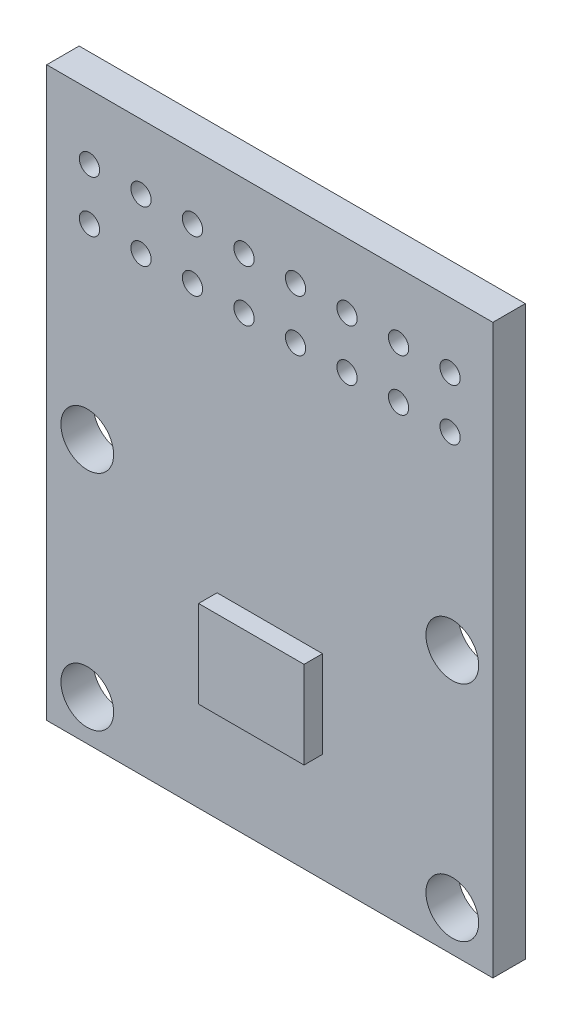
ISO-10303-21;
HEADER;
FILE_DESCRIPTION(('STEP AP214'),'2;1');
FILE_NAME('part.step','',(''),(''),'','','');
FILE_SCHEMA(('AUTOMOTIVE_DESIGN { 1 0 10303 214 1 1 1 1 }'));
ENDSEC;
DATA;
#1=APPLICATION_CONTEXT('core data for automotive mechanical design processes');
#2=APPLICATION_PROTOCOL_DEFINITION('international standard','automotive_design',2000,#1);
#3=PRODUCT_CONTEXT('',#1,'mechanical');
#4=PRODUCT('Part','Part','',(#3));
#5=PRODUCT_RELATED_PRODUCT_CATEGORY('part','',(#4));
#6=PRODUCT_DEFINITION_FORMATION('','',#4);
#7=PRODUCT_DEFINITION_CONTEXT('part definition',#1,'design');
#8=PRODUCT_DEFINITION('design','',#6,#7);
#9=PRODUCT_DEFINITION_SHAPE('','',#8);
#10=(LENGTH_UNIT() NAMED_UNIT(*) SI_UNIT(.MILLI.,.METRE.));
#11=(NAMED_UNIT(*) PLANE_ANGLE_UNIT() SI_UNIT($,.RADIAN.));
#12=(NAMED_UNIT(*) SI_UNIT($,.STERADIAN.) SOLID_ANGLE_UNIT());
#13=UNCERTAINTY_MEASURE_WITH_UNIT(LENGTH_MEASURE(1.E-05),#10,'distance_accuracy_value','');
#14=(GEOMETRIC_REPRESENTATION_CONTEXT(3) GLOBAL_UNCERTAINTY_ASSIGNED_CONTEXT((#13)) GLOBAL_UNIT_ASSIGNED_CONTEXT((#10,
#11,#12)) REPRESENTATION_CONTEXT('',''));
#15=CARTESIAN_POINT('',(0.,0.,0.));
#16=DIRECTION('',(0.,0.,1.));
#17=DIRECTION('',(1.,0.,0.));
#18=AXIS2_PLACEMENT_3D('',#15,#16,#17);
#19=CARTESIAN_POINT('',(0.,0.,1.6));
#20=DIRECTION('',(0.,0.,-1.));
#21=DIRECTION('',(-1.,0.,0.));
#22=AXIS2_PLACEMENT_3D('',#19,#20,#21);
#23=PLANE('',#22);
#24=CARTESIAN_POINT('',(-8.88999999999997,8.26,1.6));
#25=DIRECTION('',(0.,0.,1.));
#26=DIRECTION('',(1.,0.,0.));
#27=AXIS2_PLACEMENT_3D('',#24,#25,#26);
#28=CIRCLE('',#27,0.500000000000001);
#29=CARTESIAN_POINT('',(-8.38999999999997,8.26,1.6));
#30=VERTEX_POINT('',#29);
#31=EDGE_CURVE('E135',#30,#30,#28,.T.);
#32=ORIENTED_EDGE('',*,*,#31,.F.);
#33=EDGE_LOOP('',(#32));
#34=FACE_BOUND('',#33,.T.);
#35=CARTESIAN_POINT('',(8.89000000000003,8.26,1.6));
#36=DIRECTION('',(0.,0.,1.));
#37=DIRECTION('',(1.,0.,0.));
#38=AXIS2_PLACEMENT_3D('',#35,#36,#37);
#39=CIRCLE('',#38,0.500000000000001);
#40=CARTESIAN_POINT('',(9.39000000000003,8.26,1.6));
#41=VERTEX_POINT('',#40);
#42=EDGE_CURVE('E141',#41,#41,#39,.T.);
#43=ORIENTED_EDGE('',*,*,#42,.F.);
#44=EDGE_LOOP('',(#43));
#45=FACE_BOUND('',#44,.T.);
#46=CARTESIAN_POINT('',(6.35000000000003,8.26,1.6));
#47=DIRECTION('',(0.,0.,1.));
#48=DIRECTION('',(1.,0.,0.));
#49=AXIS2_PLACEMENT_3D('',#46,#47,#48);
#50=CIRCLE('',#49,0.500000000000001);
#51=CARTESIAN_POINT('',(6.85000000000003,8.26,1.6));
#52=VERTEX_POINT('',#51);
#53=EDGE_CURVE('E149',#52,#52,#50,.T.);
#54=ORIENTED_EDGE('',*,*,#53,.F.);
#55=EDGE_LOOP('',(#54));
#56=FACE_BOUND('',#55,.T.);
#57=CARTESIAN_POINT('',(3.81000000000003,8.26,1.6));
#58=DIRECTION('',(0.,0.,1.));
#59=DIRECTION('',(1.,0.,0.));
#60=AXIS2_PLACEMENT_3D('',#57,#58,#59);
#61=CIRCLE('',#60,0.500000000000001);
#62=CARTESIAN_POINT('',(4.31000000000003,8.26,1.6));
#63=VERTEX_POINT('',#62);
#64=EDGE_CURVE('E154',#63,#63,#61,.T.);
#65=ORIENTED_EDGE('',*,*,#64,.F.);
#66=EDGE_LOOP('',(#65));
#67=FACE_BOUND('',#66,.T.);
#68=CARTESIAN_POINT('',(1.27000000000003,8.26,1.6));
#69=DIRECTION('',(0.,0.,1.));
#70=DIRECTION('',(1.,0.,0.));
#71=AXIS2_PLACEMENT_3D('',#68,#69,#70);
#72=CIRCLE('',#71,0.500000000000001);
#73=CARTESIAN_POINT('',(1.77000000000003,8.26,1.6));
#74=VERTEX_POINT('',#73);
#75=EDGE_CURVE('E161',#74,#74,#72,.T.);
#76=ORIENTED_EDGE('',*,*,#75,.F.);
#77=EDGE_LOOP('',(#76));
#78=FACE_BOUND('',#77,.T.);
#79=CARTESIAN_POINT('',(-1.26999999999997,8.26,1.6));
#80=DIRECTION('',(0.,0.,1.));
#81=DIRECTION('',(1.,0.,0.));
#82=AXIS2_PLACEMENT_3D('',#79,#80,#81);
#83=CIRCLE('',#82,0.500000000000001);
#84=CARTESIAN_POINT('',(-0.769999999999972,8.26,1.6));
#85=VERTEX_POINT('',#84);
#86=EDGE_CURVE('E170',#85,#85,#83,.T.);
#87=ORIENTED_EDGE('',*,*,#86,.F.);
#88=EDGE_LOOP('',(#87));
#89=FACE_BOUND('',#88,.T.);
#90=CARTESIAN_POINT('',(-3.80999999999997,8.26,1.6));
#91=DIRECTION('',(0.,0.,1.));
#92=DIRECTION('',(1.,0.,0.));
#93=AXIS2_PLACEMENT_3D('',#90,#91,#92);
#94=CIRCLE('',#93,0.500000000000001);
#95=CARTESIAN_POINT('',(-3.30999999999997,8.26,1.6));
#96=VERTEX_POINT('',#95);
#97=EDGE_CURVE('E172',#96,#96,#94,.T.);
#98=ORIENTED_EDGE('',*,*,#97,.F.);
#99=EDGE_LOOP('',(#98));
#100=FACE_BOUND('',#99,.T.);
#101=CARTESIAN_POINT('',(-6.34999999999997,8.26,1.6));
#102=DIRECTION('',(0.,0.,1.));
#103=DIRECTION('',(1.,0.,0.));
#104=AXIS2_PLACEMENT_3D('',#101,#102,#103);
#105=CIRCLE('',#104,0.500000000000001);
#106=CARTESIAN_POINT('',(-5.84999999999997,8.26,1.6));
#107=VERTEX_POINT('',#106);
#108=EDGE_CURVE('E177',#107,#107,#105,.T.);
#109=ORIENTED_EDGE('',*,*,#108,.F.);
#110=EDGE_LOOP('',(#109));
#111=FACE_BOUND('',#110,.T.);
#112=CARTESIAN_POINT('',(8.89,10.8,1.6));
#113=DIRECTION('',(0.,0.,1.));
#114=DIRECTION('',(1.,0.,0.));
#115=AXIS2_PLACEMENT_3D('',#112,#113,#114);
#116=CIRCLE('',#115,0.500000000000001);
#117=CARTESIAN_POINT('',(9.39,10.8,1.6));
#118=VERTEX_POINT('',#117);
#119=EDGE_CURVE('E183',#118,#118,#116,.T.);
#120=ORIENTED_EDGE('',*,*,#119,.F.);
#121=EDGE_LOOP('',(#120));
#122=FACE_BOUND('',#121,.T.);
#123=CARTESIAN_POINT('',(6.35,10.8,1.6));
#124=DIRECTION('',(0.,0.,1.));
#125=DIRECTION('',(1.,0.,0.));
#126=AXIS2_PLACEMENT_3D('',#123,#124,#125);
#127=CIRCLE('',#126,0.500000000000001);
#128=CARTESIAN_POINT('',(6.85,10.8,1.6));
#129=VERTEX_POINT('',#128);
#130=EDGE_CURVE('E191',#129,#129,#127,.T.);
#131=ORIENTED_EDGE('',*,*,#130,.F.);
#132=EDGE_LOOP('',(#131));
#133=FACE_BOUND('',#132,.T.);
#134=CARTESIAN_POINT('',(3.81,10.8,1.6));
#135=DIRECTION('',(0.,0.,1.));
#136=DIRECTION('',(1.,0.,0.));
#137=AXIS2_PLACEMENT_3D('',#134,#135,#136);
#138=CIRCLE('',#137,0.500000000000001);
#139=CARTESIAN_POINT('',(4.31,10.8,1.6));
#140=VERTEX_POINT('',#139);
#141=EDGE_CURVE('E197',#140,#140,#138,.T.);
#142=ORIENTED_EDGE('',*,*,#141,.F.);
#143=EDGE_LOOP('',(#142));
#144=FACE_BOUND('',#143,.T.);
#145=CARTESIAN_POINT('',(1.27,10.8,1.6));
#146=DIRECTION('',(0.,0.,1.));
#147=DIRECTION('',(1.,0.,0.));
#148=AXIS2_PLACEMENT_3D('',#145,#146,#147);
#149=CIRCLE('',#148,0.500000000000001);
#150=CARTESIAN_POINT('',(1.77,10.8,1.6));
#151=VERTEX_POINT('',#150);
#152=EDGE_CURVE('E201',#151,#151,#149,.T.);
#153=ORIENTED_EDGE('',*,*,#152,.F.);
#154=EDGE_LOOP('',(#153));
#155=FACE_BOUND('',#154,.T.);
#156=CARTESIAN_POINT('',(-1.27,10.8,1.6));
#157=DIRECTION('',(0.,0.,1.));
#158=DIRECTION('',(1.,0.,0.));
#159=AXIS2_PLACEMENT_3D('',#156,#157,#158);
#160=CIRCLE('',#159,0.500000000000001);
#161=CARTESIAN_POINT('',(-0.769999999999999,10.8,1.6));
#162=VERTEX_POINT('',#161);
#163=EDGE_CURVE('E207',#162,#162,#160,.T.);
#164=ORIENTED_EDGE('',*,*,#163,.F.);
#165=EDGE_LOOP('',(#164));
#166=FACE_BOUND('',#165,.T.);
#167=CARTESIAN_POINT('',(-3.81,10.8,1.6));
#168=DIRECTION('',(0.,0.,1.));
#169=DIRECTION('',(1.,0.,0.));
#170=AXIS2_PLACEMENT_3D('',#167,#168,#169);
#171=CIRCLE('',#170,0.500000000000001);
#172=CARTESIAN_POINT('',(-3.31,10.8,1.6));
#173=VERTEX_POINT('',#172);
#174=EDGE_CURVE('E214',#173,#173,#171,.T.);
#175=ORIENTED_EDGE('',*,*,#174,.F.);
#176=EDGE_LOOP('',(#175));
#177=FACE_BOUND('',#176,.T.);
#178=CARTESIAN_POINT('',(-6.35,10.8,1.6));
#179=DIRECTION('',(0.,0.,1.));
#180=DIRECTION('',(1.,0.,0.));
#181=AXIS2_PLACEMENT_3D('',#178,#179,#180);
#182=CIRCLE('',#181,0.500000000000001);
#183=CARTESIAN_POINT('',(-5.85,10.8,1.6));
#184=VERTEX_POINT('',#183);
#185=EDGE_CURVE('E222',#184,#184,#182,.T.);
#186=ORIENTED_EDGE('',*,*,#185,.F.);
#187=EDGE_LOOP('',(#186));
#188=FACE_BOUND('',#187,.T.);
#189=CARTESIAN_POINT('',(-8.89,10.8,1.6));
#190=DIRECTION('',(0.,0.,1.));
#191=DIRECTION('',(1.,0.,0.));
#192=AXIS2_PLACEMENT_3D('',#189,#190,#191);
#193=CIRCLE('',#192,0.500000000000001);
#194=CARTESIAN_POINT('',(-8.39,10.8,1.6));
#195=VERTEX_POINT('',#194);
#196=EDGE_CURVE('E229',#195,#195,#193,.T.);
#197=ORIENTED_EDGE('',*,*,#196,.F.);
#198=EDGE_LOOP('',(#197));
#199=FACE_BOUND('',#198,.T.);
#200=CARTESIAN_POINT('',(9.,-1.,1.6));
#201=DIRECTION('',(0.,0.,1.));
#202=DIRECTION('',(-1.,0.,0.));
#203=AXIS2_PLACEMENT_3D('',#200,#201,#202);
#204=CIRCLE('',#203,1.3);
#205=CARTESIAN_POINT('',(7.7,-1.,1.6));
#206=VERTEX_POINT('',#205);
#207=EDGE_CURVE('E233',#206,#206,#204,.T.);
#208=ORIENTED_EDGE('',*,*,#207,.F.);
#209=EDGE_LOOP('',(#208));
#210=FACE_BOUND('',#209,.T.);
#211=CARTESIAN_POINT('',(9.,-12.,1.6));
#212=DIRECTION('',(0.,0.,1.));
#213=DIRECTION('',(-1.,0.,0.));
#214=AXIS2_PLACEMENT_3D('',#211,#212,#213);
#215=CIRCLE('',#214,1.3);
#216=CARTESIAN_POINT('',(7.7,-12.,1.6));
#217=VERTEX_POINT('',#216);
#218=EDGE_CURVE('E239',#217,#217,#215,.T.);
#219=ORIENTED_EDGE('',*,*,#218,.F.);
#220=EDGE_LOOP('',(#219));
#221=FACE_BOUND('',#220,.T.);
#222=CARTESIAN_POINT('',(-9.,-12.,1.6));
#223=DIRECTION('',(0.,0.,1.));
#224=DIRECTION('',(1.,0.,0.));
#225=AXIS2_PLACEMENT_3D('',#222,#223,#224);
#226=CIRCLE('',#225,1.3);
#227=CARTESIAN_POINT('',(-7.7,-12.,1.6));
#228=VERTEX_POINT('',#227);
#229=EDGE_CURVE('E241',#228,#228,#226,.T.);
#230=ORIENTED_EDGE('',*,*,#229,.F.);
#231=EDGE_LOOP('',(#230));
#232=FACE_BOUND('',#231,.T.);
#233=CARTESIAN_POINT('',(-9.,-1.,1.6));
#234=DIRECTION('',(0.,0.,1.));
#235=DIRECTION('',(1.,0.,0.));
#236=AXIS2_PLACEMENT_3D('',#233,#234,#235);
#237=CIRCLE('',#236,1.3);
#238=CARTESIAN_POINT('',(-7.7,-1.,1.6));
#239=VERTEX_POINT('',#238);
#240=EDGE_CURVE('E253',#239,#239,#237,.T.);
#241=ORIENTED_EDGE('',*,*,#240,.F.);
#242=EDGE_LOOP('',(#241));
#243=FACE_BOUND('',#242,.T.);
#244=DIRECTION('',(0.,1.,0.));
#245=VECTOR('',#244,1.);
#246=CARTESIAN_POINT('',(11.,-14.,1.6));
#247=LINE('',#246,#245);
#248=CARTESIAN_POINT('',(11.,-14.,1.6));
#249=VERTEX_POINT('',#248);
#250=CARTESIAN_POINT('',(11.,14.,1.6));
#251=VERTEX_POINT('',#250);
#252=EDGE_CURVE('E260',#249,#251,#247,.T.);
#253=ORIENTED_EDGE('',*,*,#252,.T.);
#254=DIRECTION('',(-1.,0.,0.));
#255=VECTOR('',#254,1.);
#256=CARTESIAN_POINT('',(-11.,14.,1.6));
#257=LINE('',#256,#255);
#258=CARTESIAN_POINT('',(-11.,14.,1.6));
#259=VERTEX_POINT('',#258);
#260=EDGE_CURVE('E257',#251,#259,#257,.T.);
#261=ORIENTED_EDGE('',*,*,#260,.T.);
#262=DIRECTION('',(0.,-1.,0.));
#263=VECTOR('',#262,1.);
#264=CARTESIAN_POINT('',(-11.,-14.,1.6));
#265=LINE('',#264,#263);
#266=CARTESIAN_POINT('',(-11.,-14.,1.6));
#267=VERTEX_POINT('',#266);
#268=EDGE_CURVE('E263',#259,#267,#265,.T.);
#269=ORIENTED_EDGE('',*,*,#268,.T.);
#270=DIRECTION('',(1.,0.,0.));
#271=VECTOR('',#270,1.);
#272=CARTESIAN_POINT('',(-11.,-14.,1.6));
#273=LINE('',#272,#271);
#274=EDGE_CURVE('E264',#267,#249,#273,.T.);
#275=ORIENTED_EDGE('',*,*,#274,.T.);
#276=EDGE_LOOP('',(#253,#261,#269,#275));
#277=FACE_BOUND('',#276,.T.);
#278=DIRECTION('',(0.,1.,0.));
#279=VECTOR('',#278,1.);
#280=CARTESIAN_POINT('',(2.6,-8.65,1.6));
#281=LINE('',#280,#279);
#282=CARTESIAN_POINT('',(2.6,-8.65,1.6));
#283=VERTEX_POINT('',#282);
#284=CARTESIAN_POINT('',(2.6,-4.35,1.6));
#285=VERTEX_POINT('',#284);
#286=EDGE_CURVE('E128',#283,#285,#281,.T.);
#287=ORIENTED_EDGE('',*,*,#286,.F.);
#288=DIRECTION('',(1.,0.,0.));
#289=VECTOR('',#288,1.);
#290=CARTESIAN_POINT('',(-2.6,-8.65,1.6));
#291=LINE('',#290,#289);
#292=CARTESIAN_POINT('',(-2.6,-8.65,1.6));
#293=VERTEX_POINT('',#292);
#294=EDGE_CURVE('E130',#293,#283,#291,.T.);
#295=ORIENTED_EDGE('',*,*,#294,.F.);
#296=DIRECTION('',(0.,-1.,0.));
#297=VECTOR('',#296,1.);
#298=CARTESIAN_POINT('',(-2.6,-8.65,1.6));
#299=LINE('',#298,#297);
#300=CARTESIAN_POINT('',(-2.6,-4.35,1.6));
#301=VERTEX_POINT('',#300);
#302=EDGE_CURVE('E61',#301,#293,#299,.T.);
#303=ORIENTED_EDGE('',*,*,#302,.F.);
#304=DIRECTION('',(-1.,0.,0.));
#305=VECTOR('',#304,1.);
#306=CARTESIAN_POINT('',(-2.6,-4.35,1.6));
#307=LINE('',#306,#305);
#308=EDGE_CURVE('E58',#285,#301,#307,.T.);
#309=ORIENTED_EDGE('',*,*,#308,.F.);
#310=EDGE_LOOP('',(#287,#295,#303,#309));
#311=FACE_BOUND('',#310,.T.);
#312=ADVANCED_FACE('F44',(#34,#45,#56,#67,#78,#89,#100,#111,#122,#133,#144,#155,#166,#177,#188,
#199,#210,#221,#232,#243,#277,#311),#23,.F.);
#313=CARTESIAN_POINT('',(0.,0.,0.));
#314=DIRECTION('',(0.,0.,-1.));
#315=DIRECTION('',(-1.,0.,0.));
#316=AXIS2_PLACEMENT_3D('',#313,#314,#315);
#317=PLANE('',#316);
#318=CARTESIAN_POINT('',(8.89000000000003,8.26,0.));
#319=DIRECTION('',(0.,0.,1.));
#320=DIRECTION('',(1.,0.,0.));
#321=AXIS2_PLACEMENT_3D('',#318,#319,#320);
#322=CIRCLE('',#321,0.500000000000001);
#323=CARTESIAN_POINT('',(9.39000000000003,8.26,0.));
#324=VERTEX_POINT('',#323);
#325=EDGE_CURVE('E143',#324,#324,#322,.T.);
#326=ORIENTED_EDGE('',*,*,#325,.T.);
#327=EDGE_LOOP('',(#326));
#328=FACE_BOUND('',#327,.T.);
#329=CARTESIAN_POINT('',(3.81000000000003,8.26,0.));
#330=DIRECTION('',(0.,0.,1.));
#331=DIRECTION('',(1.,0.,0.));
#332=AXIS2_PLACEMENT_3D('',#329,#330,#331);
#333=CIRCLE('',#332,0.500000000000001);
#334=CARTESIAN_POINT('',(4.31000000000003,8.26,0.));
#335=VERTEX_POINT('',#334);
#336=EDGE_CURVE('E155',#335,#335,#333,.T.);
#337=ORIENTED_EDGE('',*,*,#336,.T.);
#338=EDGE_LOOP('',(#337));
#339=FACE_BOUND('',#338,.T.);
#340=CARTESIAN_POINT('',(-1.26999999999997,8.26,0.));
#341=DIRECTION('',(0.,0.,1.));
#342=DIRECTION('',(1.,0.,0.));
#343=AXIS2_PLACEMENT_3D('',#340,#341,#342);
#344=CIRCLE('',#343,0.500000000000001);
#345=CARTESIAN_POINT('',(-0.769999999999972,8.26,0.));
#346=VERTEX_POINT('',#345);
#347=EDGE_CURVE('E163',#346,#346,#344,.T.);
#348=ORIENTED_EDGE('',*,*,#347,.T.);
#349=EDGE_LOOP('',(#348));
#350=FACE_BOUND('',#349,.T.);
#351=CARTESIAN_POINT('',(-6.34999999999997,8.26,0.));
#352=DIRECTION('',(0.,0.,1.));
#353=DIRECTION('',(1.,0.,0.));
#354=AXIS2_PLACEMENT_3D('',#351,#352,#353);
#355=CIRCLE('',#354,0.500000000000001);
#356=CARTESIAN_POINT('',(-5.84999999999997,8.26,0.));
#357=VERTEX_POINT('',#356);
#358=EDGE_CURVE('E176',#357,#357,#355,.T.);
#359=ORIENTED_EDGE('',*,*,#358,.T.);
#360=EDGE_LOOP('',(#359));
#361=FACE_BOUND('',#360,.T.);
#362=CARTESIAN_POINT('',(6.35,10.8,0.));
#363=DIRECTION('',(0.,0.,1.));
#364=DIRECTION('',(1.,0.,0.));
#365=AXIS2_PLACEMENT_3D('',#362,#363,#364);
#366=CIRCLE('',#365,0.500000000000001);
#367=CARTESIAN_POINT('',(6.85,10.8,0.));
#368=VERTEX_POINT('',#367);
#369=EDGE_CURVE('E187',#368,#368,#366,.T.);
#370=ORIENTED_EDGE('',*,*,#369,.T.);
#371=EDGE_LOOP('',(#370));
#372=FACE_BOUND('',#371,.T.);
#373=CARTESIAN_POINT('',(1.27,10.8,0.));
#374=DIRECTION('',(0.,0.,1.));
#375=DIRECTION('',(1.,0.,0.));
#376=AXIS2_PLACEMENT_3D('',#373,#374,#375);
#377=CIRCLE('',#376,0.500000000000001);
#378=CARTESIAN_POINT('',(1.77,10.8,0.));
#379=VERTEX_POINT('',#378);
#380=EDGE_CURVE('E199',#379,#379,#377,.T.);
#381=ORIENTED_EDGE('',*,*,#380,.T.);
#382=EDGE_LOOP('',(#381));
#383=FACE_BOUND('',#382,.T.);
#384=CARTESIAN_POINT('',(-3.81,10.8,0.));
#385=DIRECTION('',(0.,0.,1.));
#386=DIRECTION('',(1.,0.,0.));
#387=AXIS2_PLACEMENT_3D('',#384,#385,#386);
#388=CIRCLE('',#387,0.500000000000001);
#389=CARTESIAN_POINT('',(-3.31,10.8,0.));
#390=VERTEX_POINT('',#389);
#391=EDGE_CURVE('E215',#390,#390,#388,.T.);
#392=ORIENTED_EDGE('',*,*,#391,.T.);
#393=EDGE_LOOP('',(#392));
#394=FACE_BOUND('',#393,.T.);
#395=CARTESIAN_POINT('',(-8.89,10.8,0.));
#396=DIRECTION('',(0.,0.,1.));
#397=DIRECTION('',(1.,0.,0.));
#398=AXIS2_PLACEMENT_3D('',#395,#396,#397);
#399=CIRCLE('',#398,0.500000000000001);
#400=CARTESIAN_POINT('',(-8.39,10.8,0.));
#401=VERTEX_POINT('',#400);
#402=EDGE_CURVE('E221',#401,#401,#399,.T.);
#403=ORIENTED_EDGE('',*,*,#402,.T.);
#404=EDGE_LOOP('',(#403));
#405=FACE_BOUND('',#404,.T.);
#406=CARTESIAN_POINT('',(9.,-12.,0.));
#407=DIRECTION('',(0.,0.,1.));
#408=DIRECTION('',(-1.,0.,0.));
#409=AXIS2_PLACEMENT_3D('',#406,#407,#408);
#410=CIRCLE('',#409,1.3);
#411=CARTESIAN_POINT('',(7.7,-12.,0.));
#412=VERTEX_POINT('',#411);
#413=EDGE_CURVE('E237',#412,#412,#410,.T.);
#414=ORIENTED_EDGE('',*,*,#413,.T.);
#415=EDGE_LOOP('',(#414));
#416=FACE_BOUND('',#415,.T.);
#417=CARTESIAN_POINT('',(-9.,-1.,0.));
#418=DIRECTION('',(0.,0.,1.));
#419=DIRECTION('',(1.,0.,0.));
#420=AXIS2_PLACEMENT_3D('',#417,#418,#419);
#421=CIRCLE('',#420,1.3);
#422=CARTESIAN_POINT('',(-7.7,-1.,0.));
#423=VERTEX_POINT('',#422);
#424=EDGE_CURVE('E248',#423,#423,#421,.T.);
#425=ORIENTED_EDGE('',*,*,#424,.T.);
#426=EDGE_LOOP('',(#425));
#427=FACE_BOUND('',#426,.T.);
#428=DIRECTION('',(0.,1.,0.));
#429=VECTOR('',#428,1.);
#430=CARTESIAN_POINT('',(11.,-14.,0.));
#431=LINE('',#430,#429);
#432=CARTESIAN_POINT('',(11.,-14.,0.));
#433=VERTEX_POINT('',#432);
#434=CARTESIAN_POINT('',(11.,14.,0.));
#435=VERTEX_POINT('',#434);
#436=EDGE_CURVE('E255',#433,#435,#431,.T.);
#437=ORIENTED_EDGE('',*,*,#436,.F.);
#438=DIRECTION('',(1.,0.,0.));
#439=VECTOR('',#438,1.);
#440=CARTESIAN_POINT('',(-11.,-14.,0.));
#441=LINE('',#440,#439);
#442=CARTESIAN_POINT('',(-11.,-14.,0.));
#443=VERTEX_POINT('',#442);
#444=EDGE_CURVE('E261',#443,#433,#441,.T.);
#445=ORIENTED_EDGE('',*,*,#444,.F.);
#446=DIRECTION('',(0.,-1.,0.));
#447=VECTOR('',#446,1.);
#448=CARTESIAN_POINT('',(-11.,-14.,0.));
#449=LINE('',#448,#447);
#450=CARTESIAN_POINT('',(-11.,14.,0.));
#451=VERTEX_POINT('',#450);
#452=EDGE_CURVE('E275',#451,#443,#449,.T.);
#453=ORIENTED_EDGE('',*,*,#452,.F.);
#454=DIRECTION('',(-1.,0.,0.));
#455=VECTOR('',#454,1.);
#456=CARTESIAN_POINT('',(-11.,14.,0.));
#457=LINE('',#456,#455);
#458=EDGE_CURVE('E269',#435,#451,#457,.T.);
#459=ORIENTED_EDGE('',*,*,#458,.F.);
#460=EDGE_LOOP('',(#437,#445,#453,#459));
#461=FACE_BOUND('',#460,.T.);
#462=CARTESIAN_POINT('',(-9.,-12.,0.));
#463=DIRECTION('',(0.,0.,1.));
#464=DIRECTION('',(1.,0.,0.));
#465=AXIS2_PLACEMENT_3D('',#462,#463,#464);
#466=CIRCLE('',#465,1.3);
#467=CARTESIAN_POINT('',(-7.7,-12.,0.));
#468=VERTEX_POINT('',#467);
#469=EDGE_CURVE('E244',#468,#468,#466,.T.);
#470=ORIENTED_EDGE('',*,*,#469,.T.);
#471=EDGE_LOOP('',(#470));
#472=FACE_BOUND('',#471,.T.);
#473=CARTESIAN_POINT('',(9.,-1.,0.));
#474=DIRECTION('',(0.,0.,1.));
#475=DIRECTION('',(-1.,0.,0.));
#476=AXIS2_PLACEMENT_3D('',#473,#474,#475);
#477=CIRCLE('',#476,1.3);
#478=CARTESIAN_POINT('',(7.7,-1.,0.));
#479=VERTEX_POINT('',#478);
#480=EDGE_CURVE('E226',#479,#479,#477,.T.);
#481=ORIENTED_EDGE('',*,*,#480,.T.);
#482=EDGE_LOOP('',(#481));
#483=FACE_BOUND('',#482,.T.);
#484=CARTESIAN_POINT('',(-6.35,10.8,0.));
#485=DIRECTION('',(0.,0.,1.));
#486=DIRECTION('',(1.,0.,0.));
#487=AXIS2_PLACEMENT_3D('',#484,#485,#486);
#488=CIRCLE('',#487,0.500000000000001);
#489=CARTESIAN_POINT('',(-5.85,10.8,0.));
#490=VERTEX_POINT('',#489);
#491=EDGE_CURVE('E217',#490,#490,#488,.T.);
#492=ORIENTED_EDGE('',*,*,#491,.T.);
#493=EDGE_LOOP('',(#492));
#494=FACE_BOUND('',#493,.T.);
#495=CARTESIAN_POINT('',(-1.27,10.8,0.));
#496=DIRECTION('',(0.,0.,1.));
#497=DIRECTION('',(1.,0.,0.));
#498=AXIS2_PLACEMENT_3D('',#495,#496,#497);
#499=CIRCLE('',#498,0.500000000000001);
#500=CARTESIAN_POINT('',(-0.769999999999999,10.8,0.));
#501=VERTEX_POINT('',#500);
#502=EDGE_CURVE('E206',#501,#501,#499,.T.);
#503=ORIENTED_EDGE('',*,*,#502,.T.);
#504=EDGE_LOOP('',(#503));
#505=FACE_BOUND('',#504,.T.);
#506=CARTESIAN_POINT('',(3.81,10.8,0.));
#507=DIRECTION('',(0.,0.,1.));
#508=DIRECTION('',(1.,0.,0.));
#509=AXIS2_PLACEMENT_3D('',#506,#507,#508);
#510=CIRCLE('',#509,0.500000000000001);
#511=CARTESIAN_POINT('',(4.31,10.8,0.));
#512=VERTEX_POINT('',#511);
#513=EDGE_CURVE('E192',#512,#512,#510,.T.);
#514=ORIENTED_EDGE('',*,*,#513,.T.);
#515=EDGE_LOOP('',(#514));
#516=FACE_BOUND('',#515,.T.);
#517=CARTESIAN_POINT('',(8.89,10.8,0.));
#518=DIRECTION('',(0.,0.,1.));
#519=DIRECTION('',(1.,0.,0.));
#520=AXIS2_PLACEMENT_3D('',#517,#518,#519);
#521=CIRCLE('',#520,0.500000000000001);
#522=CARTESIAN_POINT('',(9.39,10.8,0.));
#523=VERTEX_POINT('',#522);
#524=EDGE_CURVE('E185',#523,#523,#521,.T.);
#525=ORIENTED_EDGE('',*,*,#524,.T.);
#526=EDGE_LOOP('',(#525));
#527=FACE_BOUND('',#526,.T.);
#528=CARTESIAN_POINT('',(-3.80999999999997,8.26,0.));
#529=DIRECTION('',(0.,0.,1.));
#530=DIRECTION('',(1.,0.,0.));
#531=AXIS2_PLACEMENT_3D('',#528,#529,#530);
#532=CIRCLE('',#531,0.500000000000001);
#533=CARTESIAN_POINT('',(-3.30999999999997,8.26,0.));
#534=VERTEX_POINT('',#533);
#535=EDGE_CURVE('E168',#534,#534,#532,.T.);
#536=ORIENTED_EDGE('',*,*,#535,.T.);
#537=EDGE_LOOP('',(#536));
#538=FACE_BOUND('',#537,.T.);
#539=CARTESIAN_POINT('',(1.27000000000003,8.26,0.));
#540=DIRECTION('',(0.,0.,1.));
#541=DIRECTION('',(1.,0.,0.));
#542=AXIS2_PLACEMENT_3D('',#539,#540,#541);
#543=CIRCLE('',#542,0.500000000000001);
#544=CARTESIAN_POINT('',(1.77000000000003,8.26,0.));
#545=VERTEX_POINT('',#544);
#546=EDGE_CURVE('E158',#545,#545,#543,.T.);
#547=ORIENTED_EDGE('',*,*,#546,.T.);
#548=EDGE_LOOP('',(#547));
#549=FACE_BOUND('',#548,.T.);
#550=CARTESIAN_POINT('',(6.35000000000003,8.26,0.));
#551=DIRECTION('',(0.,0.,1.));
#552=DIRECTION('',(1.,0.,0.));
#553=AXIS2_PLACEMENT_3D('',#550,#551,#552);
#554=CIRCLE('',#553,0.500000000000001);
#555=CARTESIAN_POINT('',(6.85000000000003,8.26,0.));
#556=VERTEX_POINT('',#555);
#557=EDGE_CURVE('E148',#556,#556,#554,.T.);
#558=ORIENTED_EDGE('',*,*,#557,.T.);
#559=EDGE_LOOP('',(#558));
#560=FACE_BOUND('',#559,.T.);
#561=CARTESIAN_POINT('',(-8.88999999999997,8.26,0.));
#562=DIRECTION('',(0.,0.,1.));
#563=DIRECTION('',(1.,0.,0.));
#564=AXIS2_PLACEMENT_3D('',#561,#562,#563);
#565=CIRCLE('',#564,0.500000000000001);
#566=CARTESIAN_POINT('',(-8.38999999999997,8.26,0.));
#567=VERTEX_POINT('',#566);
#568=EDGE_CURVE('E133',#567,#567,#565,.T.);
#569=ORIENTED_EDGE('',*,*,#568,.T.);
#570=EDGE_LOOP('',(#569));
#571=FACE_BOUND('',#570,.T.);
#572=ADVANCED_FACE('F289',(#328,#339,#350,#361,#372,#383,#394,#405,#416,#427,#461,#472,#483,
#494,#505,#516,#527,#538,#549,#560,#571),#317,.T.);
#573=CARTESIAN_POINT('',(11.,-14.,1.6));
#574=DIRECTION('',(-1.,0.,0.));
#575=DIRECTION('',(0.,0.,1.));
#576=AXIS2_PLACEMENT_3D('',#573,#574,#575);
#577=PLANE('',#576);
#578=ORIENTED_EDGE('',*,*,#436,.T.);
#579=DIRECTION('',(0.,0.,-1.));
#580=VECTOR('',#579,1.);
#581=CARTESIAN_POINT('',(11.,14.,1.6));
#582=LINE('',#581,#580);
#583=EDGE_CURVE('E11',#251,#435,#582,.T.);
#584=ORIENTED_EDGE('',*,*,#583,.F.);
#585=ORIENTED_EDGE('',*,*,#252,.F.);
#586=DIRECTION('',(0.,0.,-1.));
#587=VECTOR('',#586,1.);
#588=CARTESIAN_POINT('',(11.,-14.,1.6));
#589=LINE('',#588,#587);
#590=EDGE_CURVE('E270',#249,#433,#589,.T.);
#591=ORIENTED_EDGE('',*,*,#590,.T.);
#592=EDGE_LOOP('',(#578,#584,#585,#591));
#593=FACE_BOUND('',#592,.T.);
#594=ADVANCED_FACE('F50',(#593),#577,.F.);
#595=CARTESIAN_POINT('',(-11.,14.,1.6));
#596=DIRECTION('',(0.,-1.,0.));
#597=DIRECTION('',(0.,0.,-1.));
#598=AXIS2_PLACEMENT_3D('',#595,#596,#597);
#599=PLANE('',#598);
#600=ORIENTED_EDGE('',*,*,#458,.T.);
#601=DIRECTION('',(0.,0.,-1.));
#602=VECTOR('',#601,1.);
#603=CARTESIAN_POINT('',(-11.,14.,1.6));
#604=LINE('',#603,#602);
#605=EDGE_CURVE('E52',#259,#451,#604,.T.);
#606=ORIENTED_EDGE('',*,*,#605,.F.);
#607=ORIENTED_EDGE('',*,*,#260,.F.);
#608=ORIENTED_EDGE('',*,*,#583,.T.);
#609=EDGE_LOOP('',(#600,#606,#607,#608));
#610=FACE_BOUND('',#609,.T.);
#611=ADVANCED_FACE('F296',(#610),#599,.F.);
#612=CARTESIAN_POINT('',(-11.,-14.,1.6));
#613=DIRECTION('',(1.,0.,0.));
#614=DIRECTION('',(0.,0.,-1.));
#615=AXIS2_PLACEMENT_3D('',#612,#613,#614);
#616=PLANE('',#615);
#617=ORIENTED_EDGE('',*,*,#452,.T.);
#618=DIRECTION('',(0.,0.,-1.));
#619=VECTOR('',#618,1.);
#620=CARTESIAN_POINT('',(-11.,-14.,1.6));
#621=LINE('',#620,#619);
#622=EDGE_CURVE('E280',#267,#443,#621,.T.);
#623=ORIENTED_EDGE('',*,*,#622,.F.);
#624=ORIENTED_EDGE('',*,*,#268,.F.);
#625=ORIENTED_EDGE('',*,*,#605,.T.);
#626=EDGE_LOOP('',(#617,#623,#624,#625));
#627=FACE_BOUND('',#626,.T.);
#628=ADVANCED_FACE('F285',(#627),#616,.F.);
#629=CARTESIAN_POINT('',(-11.,-14.,1.6));
#630=DIRECTION('',(0.,1.,0.));
#631=DIRECTION('',(0.,0.,1.));
#632=AXIS2_PLACEMENT_3D('',#629,#630,#631);
#633=PLANE('',#632);
#634=ORIENTED_EDGE('',*,*,#444,.T.);
#635=ORIENTED_EDGE('',*,*,#590,.F.);
#636=ORIENTED_EDGE('',*,*,#274,.F.);
#637=ORIENTED_EDGE('',*,*,#622,.T.);
#638=EDGE_LOOP('',(#634,#635,#636,#637));
#639=FACE_BOUND('',#638,.T.);
#640=ADVANCED_FACE('F294',(#639),#633,.F.);
#641=CARTESIAN_POINT('',(-9.,-1.,1.6));
#642=DIRECTION('',(0.,0.,-1.));
#643=DIRECTION('',(-1.,0.,0.));
#644=AXIS2_PLACEMENT_3D('',#641,#642,#643);
#645=CYLINDRICAL_SURFACE('',#644,1.3);
#646=ORIENTED_EDGE('',*,*,#240,.T.);
#647=EDGE_LOOP('',(#646));
#648=FACE_BOUND('',#647,.T.);
#649=ORIENTED_EDGE('',*,*,#424,.F.);
#650=EDGE_LOOP('',(#649));
#651=FACE_BOUND('',#650,.T.);
#652=ADVANCED_FACE('F318',(#648,#651),#645,.F.);
#653=CARTESIAN_POINT('',(-9.,-12.,1.6));
#654=DIRECTION('',(0.,0.,-1.));
#655=DIRECTION('',(-1.,0.,0.));
#656=AXIS2_PLACEMENT_3D('',#653,#654,#655);
#657=CYLINDRICAL_SURFACE('',#656,1.3);
#658=ORIENTED_EDGE('',*,*,#229,.T.);
#659=EDGE_LOOP('',(#658));
#660=FACE_BOUND('',#659,.T.);
#661=ORIENTED_EDGE('',*,*,#469,.F.);
#662=EDGE_LOOP('',(#661));
#663=FACE_BOUND('',#662,.T.);
#664=ADVANCED_FACE('F324',(#660,#663),#657,.F.);
#665=CARTESIAN_POINT('',(9.,-12.,1.6));
#666=DIRECTION('',(0.,0.,-1.));
#667=DIRECTION('',(-1.,0.,0.));
#668=AXIS2_PLACEMENT_3D('',#665,#666,#667);
#669=CYLINDRICAL_SURFACE('',#668,1.3);
#670=ORIENTED_EDGE('',*,*,#218,.T.);
#671=EDGE_LOOP('',(#670));
#672=FACE_BOUND('',#671,.T.);
#673=ORIENTED_EDGE('',*,*,#413,.F.);
#674=EDGE_LOOP('',(#673));
#675=FACE_BOUND('',#674,.T.);
#676=ADVANCED_FACE('F329',(#672,#675),#669,.F.);
#677=CARTESIAN_POINT('',(9.,-1.,1.6));
#678=DIRECTION('',(0.,0.,-1.));
#679=DIRECTION('',(-1.,0.,0.));
#680=AXIS2_PLACEMENT_3D('',#677,#678,#679);
#681=CYLINDRICAL_SURFACE('',#680,1.3);
#682=ORIENTED_EDGE('',*,*,#207,.T.);
#683=EDGE_LOOP('',(#682));
#684=FACE_BOUND('',#683,.T.);
#685=ORIENTED_EDGE('',*,*,#480,.F.);
#686=EDGE_LOOP('',(#685));
#687=FACE_BOUND('',#686,.T.);
#688=ADVANCED_FACE('F336',(#684,#687),#681,.F.);
#689=CARTESIAN_POINT('',(-8.89,10.8,1.6));
#690=DIRECTION('',(0.,0.,-1.));
#691=DIRECTION('',(-1.,0.,0.));
#692=AXIS2_PLACEMENT_3D('',#689,#690,#691);
#693=CYLINDRICAL_SURFACE('',#692,0.500000000000001);
#694=ORIENTED_EDGE('',*,*,#196,.T.);
#695=EDGE_LOOP('',(#694));
#696=FACE_BOUND('',#695,.T.);
#697=ORIENTED_EDGE('',*,*,#402,.F.);
#698=EDGE_LOOP('',(#697));
#699=FACE_BOUND('',#698,.T.);
#700=ADVANCED_FACE('F350',(#696,#699),#693,.F.);
#701=CARTESIAN_POINT('',(-6.35,10.8,1.6));
#702=DIRECTION('',(0.,0.,-1.));
#703=DIRECTION('',(-1.,0.,0.));
#704=AXIS2_PLACEMENT_3D('',#701,#702,#703);
#705=CYLINDRICAL_SURFACE('',#704,0.500000000000001);
#706=ORIENTED_EDGE('',*,*,#185,.T.);
#707=EDGE_LOOP('',(#706));
#708=FACE_BOUND('',#707,.T.);
#709=ORIENTED_EDGE('',*,*,#491,.F.);
#710=EDGE_LOOP('',(#709));
#711=FACE_BOUND('',#710,.T.);
#712=ADVANCED_FACE('F353',(#708,#711),#705,.F.);
#713=CARTESIAN_POINT('',(-3.81,10.8,1.6));
#714=DIRECTION('',(0.,0.,-1.));
#715=DIRECTION('',(-1.,0.,0.));
#716=AXIS2_PLACEMENT_3D('',#713,#714,#715);
#717=CYLINDRICAL_SURFACE('',#716,0.500000000000001);
#718=ORIENTED_EDGE('',*,*,#174,.T.);
#719=EDGE_LOOP('',(#718));
#720=FACE_BOUND('',#719,.T.);
#721=ORIENTED_EDGE('',*,*,#391,.F.);
#722=EDGE_LOOP('',(#721));
#723=FACE_BOUND('',#722,.T.);
#724=ADVANCED_FACE('F351',(#720,#723),#717,.F.);
#725=CARTESIAN_POINT('',(-1.27,10.8,1.6));
#726=DIRECTION('',(0.,0.,-1.));
#727=DIRECTION('',(-1.,0.,0.));
#728=AXIS2_PLACEMENT_3D('',#725,#726,#727);
#729=CYLINDRICAL_SURFACE('',#728,0.500000000000001);
#730=ORIENTED_EDGE('',*,*,#163,.T.);
#731=EDGE_LOOP('',(#730));
#732=FACE_BOUND('',#731,.T.);
#733=ORIENTED_EDGE('',*,*,#502,.F.);
#734=EDGE_LOOP('',(#733));
#735=FACE_BOUND('',#734,.T.);
#736=ADVANCED_FACE('F357',(#732,#735),#729,.F.);
#737=CARTESIAN_POINT('',(1.27,10.8,1.6));
#738=DIRECTION('',(0.,0.,-1.));
#739=DIRECTION('',(-1.,0.,0.));
#740=AXIS2_PLACEMENT_3D('',#737,#738,#739);
#741=CYLINDRICAL_SURFACE('',#740,0.500000000000001);
#742=ORIENTED_EDGE('',*,*,#152,.T.);
#743=EDGE_LOOP('',(#742));
#744=FACE_BOUND('',#743,.T.);
#745=ORIENTED_EDGE('',*,*,#380,.F.);
#746=EDGE_LOOP('',(#745));
#747=FACE_BOUND('',#746,.T.);
#748=ADVANCED_FACE('F361',(#744,#747),#741,.F.);
#749=CARTESIAN_POINT('',(3.81,10.8,1.6));
#750=DIRECTION('',(0.,0.,-1.));
#751=DIRECTION('',(-1.,0.,0.));
#752=AXIS2_PLACEMENT_3D('',#749,#750,#751);
#753=CYLINDRICAL_SURFACE('',#752,0.500000000000001);
#754=ORIENTED_EDGE('',*,*,#141,.T.);
#755=EDGE_LOOP('',(#754));
#756=FACE_BOUND('',#755,.T.);
#757=ORIENTED_EDGE('',*,*,#513,.F.);
#758=EDGE_LOOP('',(#757));
#759=FACE_BOUND('',#758,.T.);
#760=ADVANCED_FACE('F370',(#756,#759),#753,.F.);
#761=CARTESIAN_POINT('',(6.35,10.8,1.6));
#762=DIRECTION('',(0.,0.,-1.));
#763=DIRECTION('',(-1.,0.,0.));
#764=AXIS2_PLACEMENT_3D('',#761,#762,#763);
#765=CYLINDRICAL_SURFACE('',#764,0.500000000000001);
#766=ORIENTED_EDGE('',*,*,#130,.T.);
#767=EDGE_LOOP('',(#766));
#768=FACE_BOUND('',#767,.T.);
#769=ORIENTED_EDGE('',*,*,#369,.F.);
#770=EDGE_LOOP('',(#769));
#771=FACE_BOUND('',#770,.T.);
#772=ADVANCED_FACE('F371',(#768,#771),#765,.F.);
#773=CARTESIAN_POINT('',(8.89,10.8,1.6));
#774=DIRECTION('',(0.,0.,-1.));
#775=DIRECTION('',(-1.,0.,0.));
#776=AXIS2_PLACEMENT_3D('',#773,#774,#775);
#777=CYLINDRICAL_SURFACE('',#776,0.500000000000001);
#778=ORIENTED_EDGE('',*,*,#119,.T.);
#779=EDGE_LOOP('',(#778));
#780=FACE_BOUND('',#779,.T.);
#781=ORIENTED_EDGE('',*,*,#524,.F.);
#782=EDGE_LOOP('',(#781));
#783=FACE_BOUND('',#782,.T.);
#784=ADVANCED_FACE('F374',(#780,#783),#777,.F.);
#785=CARTESIAN_POINT('',(-6.34999999999997,8.26,1.6));
#786=DIRECTION('',(0.,0.,-1.));
#787=DIRECTION('',(-1.,0.,0.));
#788=AXIS2_PLACEMENT_3D('',#785,#786,#787);
#789=CYLINDRICAL_SURFACE('',#788,0.500000000000001);
#790=ORIENTED_EDGE('',*,*,#108,.T.);
#791=EDGE_LOOP('',(#790));
#792=FACE_BOUND('',#791,.T.);
#793=ORIENTED_EDGE('',*,*,#358,.F.);
#794=EDGE_LOOP('',(#793));
#795=FACE_BOUND('',#794,.T.);
#796=ADVANCED_FACE('F377',(#792,#795),#789,.F.);
#797=CARTESIAN_POINT('',(-3.80999999999997,8.26,1.6));
#798=DIRECTION('',(0.,0.,-1.));
#799=DIRECTION('',(-1.,0.,0.));
#800=AXIS2_PLACEMENT_3D('',#797,#798,#799);
#801=CYLINDRICAL_SURFACE('',#800,0.500000000000001);
#802=ORIENTED_EDGE('',*,*,#97,.T.);
#803=EDGE_LOOP('',(#802));
#804=FACE_BOUND('',#803,.T.);
#805=ORIENTED_EDGE('',*,*,#535,.F.);
#806=EDGE_LOOP('',(#805));
#807=FACE_BOUND('',#806,.T.);
#808=ADVANCED_FACE('F382',(#804,#807),#801,.F.);
#809=CARTESIAN_POINT('',(-1.26999999999997,8.26,1.6));
#810=DIRECTION('',(0.,0.,-1.));
#811=DIRECTION('',(-1.,0.,0.));
#812=AXIS2_PLACEMENT_3D('',#809,#810,#811);
#813=CYLINDRICAL_SURFACE('',#812,0.500000000000001);
#814=ORIENTED_EDGE('',*,*,#86,.T.);
#815=EDGE_LOOP('',(#814));
#816=FACE_BOUND('',#815,.T.);
#817=ORIENTED_EDGE('',*,*,#347,.F.);
#818=EDGE_LOOP('',(#817));
#819=FACE_BOUND('',#818,.T.);
#820=ADVANCED_FACE('F390',(#816,#819),#813,.F.);
#821=CARTESIAN_POINT('',(1.27000000000003,8.26,1.6));
#822=DIRECTION('',(0.,0.,-1.));
#823=DIRECTION('',(-1.,0.,0.));
#824=AXIS2_PLACEMENT_3D('',#821,#822,#823);
#825=CYLINDRICAL_SURFACE('',#824,0.500000000000001);
#826=ORIENTED_EDGE('',*,*,#75,.T.);
#827=EDGE_LOOP('',(#826));
#828=FACE_BOUND('',#827,.T.);
#829=ORIENTED_EDGE('',*,*,#546,.F.);
#830=EDGE_LOOP('',(#829));
#831=FACE_BOUND('',#830,.T.);
#832=ADVANCED_FACE('F393',(#828,#831),#825,.F.);
#833=CARTESIAN_POINT('',(3.81000000000003,8.26,1.6));
#834=DIRECTION('',(0.,0.,-1.));
#835=DIRECTION('',(-1.,0.,0.));
#836=AXIS2_PLACEMENT_3D('',#833,#834,#835);
#837=CYLINDRICAL_SURFACE('',#836,0.500000000000001);
#838=ORIENTED_EDGE('',*,*,#64,.T.);
#839=EDGE_LOOP('',(#838));
#840=FACE_BOUND('',#839,.T.);
#841=ORIENTED_EDGE('',*,*,#336,.F.);
#842=EDGE_LOOP('',(#841));
#843=FACE_BOUND('',#842,.T.);
#844=ADVANCED_FACE('F391',(#840,#843),#837,.F.);
#845=CARTESIAN_POINT('',(6.35000000000003,8.26,1.6));
#846=DIRECTION('',(0.,0.,-1.));
#847=DIRECTION('',(-1.,0.,0.));
#848=AXIS2_PLACEMENT_3D('',#845,#846,#847);
#849=CYLINDRICAL_SURFACE('',#848,0.500000000000001);
#850=ORIENTED_EDGE('',*,*,#53,.T.);
#851=EDGE_LOOP('',(#850));
#852=FACE_BOUND('',#851,.T.);
#853=ORIENTED_EDGE('',*,*,#557,.F.);
#854=EDGE_LOOP('',(#853));
#855=FACE_BOUND('',#854,.T.);
#856=ADVANCED_FACE('F397',(#852,#855),#849,.F.);
#857=CARTESIAN_POINT('',(8.89000000000003,8.26,1.6));
#858=DIRECTION('',(0.,0.,-1.));
#859=DIRECTION('',(-1.,0.,0.));
#860=AXIS2_PLACEMENT_3D('',#857,#858,#859);
#861=CYLINDRICAL_SURFACE('',#860,0.500000000000001);
#862=ORIENTED_EDGE('',*,*,#42,.T.);
#863=EDGE_LOOP('',(#862));
#864=FACE_BOUND('',#863,.T.);
#865=ORIENTED_EDGE('',*,*,#325,.F.);
#866=EDGE_LOOP('',(#865));
#867=FACE_BOUND('',#866,.T.);
#868=ADVANCED_FACE('F401',(#864,#867),#861,.F.);
#869=CARTESIAN_POINT('',(-8.88999999999997,8.26,1.6));
#870=DIRECTION('',(0.,0.,-1.));
#871=DIRECTION('',(-1.,0.,0.));
#872=AXIS2_PLACEMENT_3D('',#869,#870,#871);
#873=CYLINDRICAL_SURFACE('',#872,0.500000000000001);
#874=ORIENTED_EDGE('',*,*,#31,.T.);
#875=EDGE_LOOP('',(#874));
#876=FACE_BOUND('',#875,.T.);
#877=ORIENTED_EDGE('',*,*,#568,.F.);
#878=EDGE_LOOP('',(#877));
#879=FACE_BOUND('',#878,.T.);
#880=ADVANCED_FACE('F409',(#876,#879),#873,.F.);
#881=CARTESIAN_POINT('',(2.6,-8.65,2.51));
#882=DIRECTION('',(-1.,0.,0.));
#883=DIRECTION('',(0.,0.,1.));
#884=AXIS2_PLACEMENT_3D('',#881,#882,#883);
#885=PLANE('',#884);
#886=ORIENTED_EDGE('',*,*,#286,.T.);
#887=DIRECTION('',(0.,0.,-1.));
#888=VECTOR('',#887,1.);
#889=CARTESIAN_POINT('',(2.6,-4.35,2.51));
#890=LINE('',#889,#888);
#891=CARTESIAN_POINT('',(2.6,-4.35,2.51));
#892=VERTEX_POINT('',#891);
#893=EDGE_CURVE('E112',#892,#285,#890,.T.);
#894=ORIENTED_EDGE('',*,*,#893,.F.);
#895=DIRECTION('',(0.,1.,0.));
#896=VECTOR('',#895,1.);
#897=CARTESIAN_POINT('',(2.6,-8.65,2.51));
#898=LINE('',#897,#896);
#899=CARTESIAN_POINT('',(2.6,-8.65,2.51));
#900=VERTEX_POINT('',#899);
#901=EDGE_CURVE('E117',#900,#892,#898,.T.);
#902=ORIENTED_EDGE('',*,*,#901,.F.);
#903=DIRECTION('',(0.,0.,-1.));
#904=VECTOR('',#903,1.);
#905=CARTESIAN_POINT('',(2.6,-8.65,2.51));
#906=LINE('',#905,#904);
#907=EDGE_CURVE('E730',#900,#283,#906,.T.);
#908=ORIENTED_EDGE('',*,*,#907,.T.);
#909=EDGE_LOOP('',(#886,#894,#902,#908));
#910=FACE_BOUND('',#909,.T.);
#911=ADVANCED_FACE('F129',(#910),#885,.F.);
#912=CARTESIAN_POINT('',(-2.6,-4.35,2.51));
#913=DIRECTION('',(0.,-1.,0.));
#914=DIRECTION('',(0.,0.,-1.));
#915=AXIS2_PLACEMENT_3D('',#912,#913,#914);
#916=PLANE('',#915);
#917=ORIENTED_EDGE('',*,*,#308,.T.);
#918=DIRECTION('',(0.,0.,-1.));
#919=VECTOR('',#918,1.);
#920=CARTESIAN_POINT('',(-2.6,-4.35,2.51));
#921=LINE('',#920,#919);
#922=CARTESIAN_POINT('',(-2.6,-4.35,2.51));
#923=VERTEX_POINT('',#922);
#924=EDGE_CURVE('E111',#923,#301,#921,.T.);
#925=ORIENTED_EDGE('',*,*,#924,.F.);
#926=DIRECTION('',(-1.,0.,0.));
#927=VECTOR('',#926,1.);
#928=CARTESIAN_POINT('',(-2.6,-4.35,2.51));
#929=LINE('',#928,#927);
#930=EDGE_CURVE('E110',#892,#923,#929,.T.);
#931=ORIENTED_EDGE('',*,*,#930,.F.);
#932=ORIENTED_EDGE('',*,*,#893,.T.);
#933=EDGE_LOOP('',(#917,#925,#931,#932));
#934=FACE_BOUND('',#933,.T.);
#935=ADVANCED_FACE('F108',(#934),#916,.F.);
#936=CARTESIAN_POINT('',(-2.6,-8.65,2.51));
#937=DIRECTION('',(1.,0.,0.));
#938=DIRECTION('',(0.,0.,-1.));
#939=AXIS2_PLACEMENT_3D('',#936,#937,#938);
#940=PLANE('',#939);
#941=ORIENTED_EDGE('',*,*,#302,.T.);
#942=DIRECTION('',(0.,0.,-1.));
#943=VECTOR('',#942,1.);
#944=CARTESIAN_POINT('',(-2.6,-8.65,2.51));
#945=LINE('',#944,#943);
#946=CARTESIAN_POINT('',(-2.6,-8.65,2.51));
#947=VERTEX_POINT('',#946);
#948=EDGE_CURVE('E136',#947,#293,#945,.T.);
#949=ORIENTED_EDGE('',*,*,#948,.F.);
#950=DIRECTION('',(0.,-1.,0.));
#951=VECTOR('',#950,1.);
#952=CARTESIAN_POINT('',(-2.6,-8.65,2.51));
#953=LINE('',#952,#951);
#954=EDGE_CURVE('E119',#923,#947,#953,.T.);
#955=ORIENTED_EDGE('',*,*,#954,.F.);
#956=ORIENTED_EDGE('',*,*,#924,.T.);
#957=EDGE_LOOP('',(#941,#949,#955,#956));
#958=FACE_BOUND('',#957,.T.);
#959=ADVANCED_FACE('F418',(#958),#940,.F.);
#960=CARTESIAN_POINT('',(-2.6,-8.65,2.51));
#961=DIRECTION('',(0.,1.,0.));
#962=DIRECTION('',(0.,0.,1.));
#963=AXIS2_PLACEMENT_3D('',#960,#961,#962);
#964=PLANE('',#963);
#965=ORIENTED_EDGE('',*,*,#294,.T.);
#966=ORIENTED_EDGE('',*,*,#907,.F.);
#967=DIRECTION('',(1.,0.,0.));
#968=VECTOR('',#967,1.);
#969=CARTESIAN_POINT('',(-2.6,-8.65,2.51));
#970=LINE('',#969,#968);
#971=EDGE_CURVE('E123',#947,#900,#970,.T.);
#972=ORIENTED_EDGE('',*,*,#971,.F.);
#973=ORIENTED_EDGE('',*,*,#948,.T.);
#974=EDGE_LOOP('',(#965,#966,#972,#973));
#975=FACE_BOUND('',#974,.T.);
#976=ADVANCED_FACE('F420',(#975),#964,.F.);
#977=CARTESIAN_POINT('',(0.,0.,2.51));
#978=DIRECTION('',(0.,0.,-1.));
#979=DIRECTION('',(-1.,0.,0.));
#980=AXIS2_PLACEMENT_3D('',#977,#978,#979);
#981=PLANE('',#980);
#982=ORIENTED_EDGE('',*,*,#901,.T.);
#983=ORIENTED_EDGE('',*,*,#930,.T.);
#984=ORIENTED_EDGE('',*,*,#954,.T.);
#985=ORIENTED_EDGE('',*,*,#971,.T.);
#986=EDGE_LOOP('',(#982,#983,#984,#985));
#987=FACE_BOUND('',#986,.T.);
#988=ADVANCED_FACE('F121',(#987),#981,.F.);
#989=CLOSED_SHELL('',(#312,#572,#594,#611,#628,#640,#652,#664,#676,#688,#700,#712,#724,#736,
#748,#760,#772,#784,#796,#808,#820,#832,#844,#856,#868,#880,#911,#935,#959,#976,#988));
#990=MANIFOLD_SOLID_BREP('B2',#989);
#991=ADVANCED_BREP_SHAPE_REPRESENTATION('',(#18,#990),#14);
#992=SHAPE_DEFINITION_REPRESENTATION(#9,#991);
ENDSEC;
END-ISO-10303-21;
